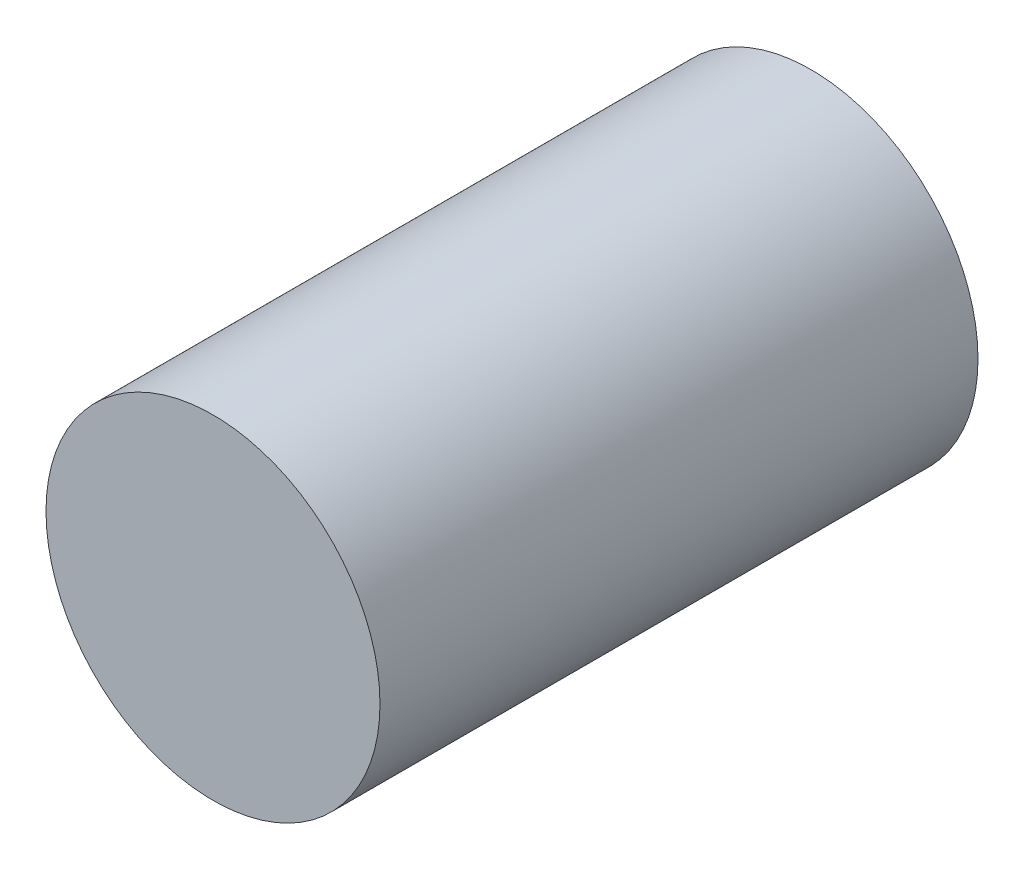
ISO-10303-21;
HEADER;
FILE_DESCRIPTION(('STEP AP214'),'2;1');
FILE_NAME('part.step','',(''),(''),'','','');
FILE_SCHEMA(('AUTOMOTIVE_DESIGN { 1 0 10303 214 1 1 1 1 }'));
ENDSEC;
DATA;
#1=APPLICATION_CONTEXT('core data for automotive mechanical design processes');
#2=APPLICATION_PROTOCOL_DEFINITION('international standard','automotive_design',2000,#1);
#3=PRODUCT_CONTEXT('',#1,'mechanical');
#4=PRODUCT('Part','Part','',(#3));
#5=PRODUCT_RELATED_PRODUCT_CATEGORY('part','',(#4));
#6=PRODUCT_DEFINITION_FORMATION('','',#4);
#7=PRODUCT_DEFINITION_CONTEXT('part definition',#1,'design');
#8=PRODUCT_DEFINITION('design','',#6,#7);
#9=PRODUCT_DEFINITION_SHAPE('','',#8);
#10=(LENGTH_UNIT() NAMED_UNIT(*) SI_UNIT(.MILLI.,.METRE.));
#11=(NAMED_UNIT(*) PLANE_ANGLE_UNIT() SI_UNIT($,.RADIAN.));
#12=(NAMED_UNIT(*) SI_UNIT($,.STERADIAN.) SOLID_ANGLE_UNIT());
#13=UNCERTAINTY_MEASURE_WITH_UNIT(LENGTH_MEASURE(1.E-05),#10,'distance_accuracy_value','');
#14=(GEOMETRIC_REPRESENTATION_CONTEXT(3) GLOBAL_UNCERTAINTY_ASSIGNED_CONTEXT((#13)) GLOBAL_UNIT_ASSIGNED_CONTEXT((#10,
#11,#12)) REPRESENTATION_CONTEXT('',''));
#15=CARTESIAN_POINT('',(0.,0.,0.));
#16=DIRECTION('',(0.,0.,1.));
#17=DIRECTION('',(1.,0.,0.));
#18=AXIS2_PLACEMENT_3D('',#15,#16,#17);
#19=CARTESIAN_POINT('',(0.,0.,114.6048));
#20=DIRECTION('',(0.,0.,-1.));
#21=DIRECTION('',(-1.,0.,0.));
#22=AXIS2_PLACEMENT_3D('',#19,#20,#21);
#23=CYLINDRICAL_SURFACE('',#22,32.004);
#24=CARTESIAN_POINT('',(0.,0.,114.6048));
#25=DIRECTION('',(0.,0.,1.));
#26=DIRECTION('',(1.,0.,0.));
#27=AXIS2_PLACEMENT_3D('',#24,#25,#26);
#28=CIRCLE('',#27,32.004);
#29=CARTESIAN_POINT('',(32.004,0.,114.6048));
#30=VERTEX_POINT('',#29);
#31=EDGE_CURVE('E10',#30,#30,#28,.T.);
#32=ORIENTED_EDGE('',*,*,#31,.F.);
#33=EDGE_LOOP('',(#32));
#34=FACE_BOUND('',#33,.T.);
#35=CARTESIAN_POINT('',(0.,0.,0.));
#36=DIRECTION('',(0.,0.,1.));
#37=DIRECTION('',(1.,0.,0.));
#38=AXIS2_PLACEMENT_3D('',#35,#36,#37);
#39=CIRCLE('',#38,32.004);
#40=CARTESIAN_POINT('',(32.004,0.,0.));
#41=VERTEX_POINT('',#40);
#42=EDGE_CURVE('E34',#41,#41,#39,.T.);
#43=ORIENTED_EDGE('',*,*,#42,.T.);
#44=EDGE_LOOP('',(#43));
#45=FACE_BOUND('',#44,.T.);
#46=ADVANCED_FACE('F31',(#34,#45),#23,.T.);
#47=CARTESIAN_POINT('',(0.,0.,114.6048));
#48=DIRECTION('',(0.,0.,1.));
#49=DIRECTION('',(1.,0.,0.));
#50=AXIS2_PLACEMENT_3D('',#47,#48,#49);
#51=PLANE('',#50);
#52=ORIENTED_EDGE('',*,*,#31,.T.);
#53=EDGE_LOOP('',(#52));
#54=FACE_BOUND('',#53,.T.);
#55=ADVANCED_FACE('F46',(#54),#51,.T.);
#56=CARTESIAN_POINT('',(0.,0.,0.));
#57=DIRECTION('',(0.,0.,1.));
#58=DIRECTION('',(1.,0.,0.));
#59=AXIS2_PLACEMENT_3D('',#56,#57,#58);
#60=PLANE('',#59);
#61=ORIENTED_EDGE('',*,*,#42,.F.);
#62=EDGE_LOOP('',(#61));
#63=FACE_BOUND('',#62,.T.);
#64=ADVANCED_FACE('F44',(#63),#60,.F.);
#65=CLOSED_SHELL('',(#46,#55,#64));
#66=MANIFOLD_SOLID_BREP('B2',#65);
#67=ADVANCED_BREP_SHAPE_REPRESENTATION('',(#18,#66),#14);
#68=SHAPE_DEFINITION_REPRESENTATION(#9,#67);
ENDSEC;
END-ISO-10303-21;
